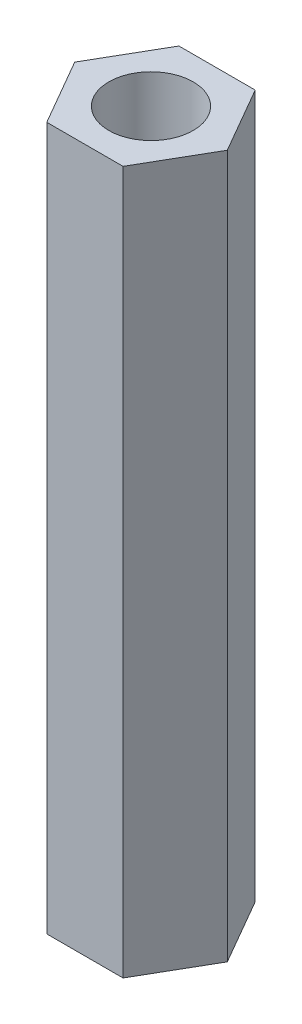
ISO-10303-21;
HEADER;
FILE_DESCRIPTION(('STEP AP214'),'2;1');
FILE_NAME('part.step','',(''),(''),'','','');
FILE_SCHEMA(('AUTOMOTIVE_DESIGN { 1 0 10303 214 1 1 1 1 }'));
ENDSEC;
DATA;
#1=APPLICATION_CONTEXT('core data for automotive mechanical design processes');
#2=APPLICATION_PROTOCOL_DEFINITION('international standard','automotive_design',2000,#1);
#3=PRODUCT_CONTEXT('',#1,'mechanical');
#4=PRODUCT('Part','Part','',(#3));
#5=PRODUCT_RELATED_PRODUCT_CATEGORY('part','',(#4));
#6=PRODUCT_DEFINITION_FORMATION('','',#4);
#7=PRODUCT_DEFINITION_CONTEXT('part definition',#1,'design');
#8=PRODUCT_DEFINITION('design','',#6,#7);
#9=PRODUCT_DEFINITION_SHAPE('','',#8);
#10=(LENGTH_UNIT() NAMED_UNIT(*) SI_UNIT(.MILLI.,.METRE.));
#11=(NAMED_UNIT(*) PLANE_ANGLE_UNIT() SI_UNIT($,.RADIAN.));
#12=(NAMED_UNIT(*) SI_UNIT($,.STERADIAN.) SOLID_ANGLE_UNIT());
#13=UNCERTAINTY_MEASURE_WITH_UNIT(LENGTH_MEASURE(1.E-05),#10,'distance_accuracy_value','');
#14=(GEOMETRIC_REPRESENTATION_CONTEXT(3) GLOBAL_UNCERTAINTY_ASSIGNED_CONTEXT((#13)) GLOBAL_UNIT_ASSIGNED_CONTEXT((#10,
#11,#12)) REPRESENTATION_CONTEXT('',''));
#15=CARTESIAN_POINT('',(0.,0.,0.));
#16=DIRECTION('',(0.,0.,1.));
#17=DIRECTION('',(1.,0.,0.));
#18=AXIS2_PLACEMENT_3D('',#15,#16,#17);
#19=CARTESIAN_POINT('',(0.,25.,0.));
#20=DIRECTION('',(0.,1.,0.));
#21=DIRECTION('',(0.,0.,1.));
#22=AXIS2_PLACEMENT_3D('',#19,#20,#21);
#23=PLANE('',#22);
#24=DIRECTION('',(0.5,0.,-0.866025403784439));
#25=VECTOR('',#24,1.);
#26=CARTESIAN_POINT('',(1.35677313259562,25.,2.35));
#27=LINE('',#26,#25);
#28=CARTESIAN_POINT('',(1.35677313259562,25.,2.35));
#29=VERTEX_POINT('',#28);
#30=CARTESIAN_POINT('',(2.71354626519124,25.,0.));
#31=VERTEX_POINT('',#30);
#32=EDGE_CURVE('E130',#29,#31,#27,.T.);
#33=ORIENTED_EDGE('',*,*,#32,.T.);
#34=DIRECTION('',(-0.5,0.,-0.866025403784439));
#35=VECTOR('',#34,1.);
#36=CARTESIAN_POINT('',(2.71354626519124,25.,0.));
#37=LINE('',#36,#35);
#38=CARTESIAN_POINT('',(1.35677313259562,25.,-2.35));
#39=VERTEX_POINT('',#38);
#40=EDGE_CURVE('E88',#31,#39,#37,.T.);
#41=ORIENTED_EDGE('',*,*,#40,.T.);
#42=DIRECTION('',(-1.,0.,0.));
#43=VECTOR('',#42,1.);
#44=CARTESIAN_POINT('',(1.35677313259562,25.,-2.35));
#45=LINE('',#44,#43);
#46=CARTESIAN_POINT('',(-1.35677313259562,25.,-2.35));
#47=VERTEX_POINT('',#46);
#48=EDGE_CURVE('E101',#39,#47,#45,.T.);
#49=ORIENTED_EDGE('',*,*,#48,.T.);
#50=DIRECTION('',(-0.5,0.,0.866025403784439));
#51=VECTOR('',#50,1.);
#52=CARTESIAN_POINT('',(-1.35677313259562,25.,-2.35));
#53=LINE('',#52,#51);
#54=CARTESIAN_POINT('',(-2.71354626519124,25.,0.));
#55=VERTEX_POINT('',#54);
#56=EDGE_CURVE('E95',#47,#55,#53,.T.);
#57=ORIENTED_EDGE('',*,*,#56,.T.);
#58=DIRECTION('',(0.5,0.,0.866025403784439));
#59=VECTOR('',#58,1.);
#60=CARTESIAN_POINT('',(-2.71354626519124,25.,0.));
#61=LINE('',#60,#59);
#62=CARTESIAN_POINT('',(-1.35677313259562,25.,2.35));
#63=VERTEX_POINT('',#62);
#64=EDGE_CURVE('E99',#55,#63,#61,.T.);
#65=ORIENTED_EDGE('',*,*,#64,.T.);
#66=DIRECTION('',(1.,0.,0.));
#67=VECTOR('',#66,1.);
#68=CARTESIAN_POINT('',(-1.35677313259562,25.,2.35));
#69=LINE('',#68,#67);
#70=EDGE_CURVE('E51',#63,#29,#69,.T.);
#71=ORIENTED_EDGE('',*,*,#70,.T.);
#72=EDGE_LOOP('',(#33,#41,#49,#57,#65,#71));
#73=FACE_BOUND('',#72,.T.);
#74=CARTESIAN_POINT('',(0.,25.,0.));
#75=DIRECTION('',(0.,1.,0.));
#76=DIRECTION('',(0.,0.,1.));
#77=AXIS2_PLACEMENT_3D('',#74,#75,#76);
#78=CIRCLE('',#77,1.5);
#79=CARTESIAN_POINT('',(0.,25.,1.5));
#80=VERTEX_POINT('',#79);
#81=EDGE_CURVE('E123',#80,#80,#78,.T.);
#82=ORIENTED_EDGE('',*,*,#81,.F.);
#83=EDGE_LOOP('',(#82));
#84=FACE_BOUND('',#83,.T.);
#85=ADVANCED_FACE('F34',(#73,#84),#23,.T.);
#86=CARTESIAN_POINT('',(0.,0.,0.));
#87=DIRECTION('',(0.,1.,0.));
#88=DIRECTION('',(0.,0.,1.));
#89=AXIS2_PLACEMENT_3D('',#86,#87,#88);
#90=PLANE('',#89);
#91=DIRECTION('',(0.5,0.,-0.866025403784439));
#92=VECTOR('',#91,1.);
#93=CARTESIAN_POINT('',(1.35677313259562,0.,2.35));
#94=LINE('',#93,#92);
#95=CARTESIAN_POINT('',(1.35677313259562,0.,2.35));
#96=VERTEX_POINT('',#95);
#97=CARTESIAN_POINT('',(2.71354626519124,0.,0.));
#98=VERTEX_POINT('',#97);
#99=EDGE_CURVE('E119',#96,#98,#94,.T.);
#100=ORIENTED_EDGE('',*,*,#99,.F.);
#101=DIRECTION('',(1.,0.,0.));
#102=VECTOR('',#101,1.);
#103=CARTESIAN_POINT('',(-1.35677313259562,0.,2.35));
#104=LINE('',#103,#102);
#105=CARTESIAN_POINT('',(-1.35677313259562,0.,2.35));
#106=VERTEX_POINT('',#105);
#107=EDGE_CURVE('E80',#106,#96,#104,.T.);
#108=ORIENTED_EDGE('',*,*,#107,.F.);
#109=DIRECTION('',(0.5,0.,0.866025403784439));
#110=VECTOR('',#109,1.);
#111=CARTESIAN_POINT('',(-2.71354626519124,0.,0.));
#112=LINE('',#111,#110);
#113=CARTESIAN_POINT('',(-2.71354626519124,0.,0.));
#114=VERTEX_POINT('',#113);
#115=EDGE_CURVE('E74',#114,#106,#112,.T.);
#116=ORIENTED_EDGE('',*,*,#115,.F.);
#117=DIRECTION('',(-0.5,0.,0.866025403784439));
#118=VECTOR('',#117,1.);
#119=CARTESIAN_POINT('',(-1.35677313259562,0.,-2.35));
#120=LINE('',#119,#118);
#121=CARTESIAN_POINT('',(-1.35677313259562,0.,-2.35));
#122=VERTEX_POINT('',#121);
#123=EDGE_CURVE('E109',#122,#114,#120,.T.);
#124=ORIENTED_EDGE('',*,*,#123,.F.);
#125=DIRECTION('',(-1.,0.,0.));
#126=VECTOR('',#125,1.);
#127=CARTESIAN_POINT('',(1.35677313259562,0.,-2.35));
#128=LINE('',#127,#126);
#129=CARTESIAN_POINT('',(1.35677313259562,0.,-2.35));
#130=VERTEX_POINT('',#129);
#131=EDGE_CURVE('E125',#130,#122,#128,.T.);
#132=ORIENTED_EDGE('',*,*,#131,.F.);
#133=DIRECTION('',(-0.5,0.,-0.866025403784439));
#134=VECTOR('',#133,1.);
#135=CARTESIAN_POINT('',(2.71354626519124,0.,0.));
#136=LINE('',#135,#134);
#137=EDGE_CURVE('E122',#98,#130,#136,.T.);
#138=ORIENTED_EDGE('',*,*,#137,.F.);
#139=EDGE_LOOP('',(#100,#108,#116,#124,#132,#138));
#140=FACE_BOUND('',#139,.T.);
#141=CARTESIAN_POINT('',(0.,0.,0.));
#142=DIRECTION('',(0.,1.,0.));
#143=DIRECTION('',(0.,0.,1.));
#144=AXIS2_PLACEMENT_3D('',#141,#142,#143);
#145=CIRCLE('',#144,1.5);
#146=CARTESIAN_POINT('',(0.,0.,1.5));
#147=VERTEX_POINT('',#146);
#148=EDGE_CURVE('E223',#147,#147,#145,.T.);
#149=ORIENTED_EDGE('',*,*,#148,.T.);
#150=EDGE_LOOP('',(#149));
#151=FACE_BOUND('',#150,.T.);
#152=ADVANCED_FACE('F139',(#140,#151),#90,.F.);
#153=CARTESIAN_POINT('',(1.35677313259562,25.,2.35));
#154=DIRECTION('',(-0.866025403784439,0.,-0.5));
#155=DIRECTION('',(-0.5,0.,0.866025403784439));
#156=AXIS2_PLACEMENT_3D('',#153,#154,#155);
#157=PLANE('',#156);
#158=ORIENTED_EDGE('',*,*,#99,.T.);
#159=DIRECTION('',(0.,-1.,0.));
#160=VECTOR('',#159,1.);
#161=CARTESIAN_POINT('',(2.71354626519124,25.,0.));
#162=LINE('',#161,#160);
#163=EDGE_CURVE('E11',#31,#98,#162,.T.);
#164=ORIENTED_EDGE('',*,*,#163,.F.);
#165=ORIENTED_EDGE('',*,*,#32,.F.);
#166=DIRECTION('',(0.,-1.,0.));
#167=VECTOR('',#166,1.);
#168=CARTESIAN_POINT('',(1.35677313259562,25.,2.35));
#169=LINE('',#168,#167);
#170=EDGE_CURVE('E115',#29,#96,#169,.T.);
#171=ORIENTED_EDGE('',*,*,#170,.T.);
#172=EDGE_LOOP('',(#158,#164,#165,#171));
#173=FACE_BOUND('',#172,.T.);
#174=ADVANCED_FACE('F36',(#173),#157,.F.);
#175=CARTESIAN_POINT('',(2.71354626519124,25.,0.));
#176=DIRECTION('',(-0.866025403784439,0.,0.5));
#177=DIRECTION('',(0.5,0.,0.866025403784439));
#178=AXIS2_PLACEMENT_3D('',#175,#176,#177);
#179=PLANE('',#178);
#180=ORIENTED_EDGE('',*,*,#137,.T.);
#181=DIRECTION('',(0.,-1.,0.));
#182=VECTOR('',#181,1.);
#183=CARTESIAN_POINT('',(1.35677313259562,25.,-2.35));
#184=LINE('',#183,#182);
#185=EDGE_CURVE('E43',#39,#130,#184,.T.);
#186=ORIENTED_EDGE('',*,*,#185,.F.);
#187=ORIENTED_EDGE('',*,*,#40,.F.);
#188=ORIENTED_EDGE('',*,*,#163,.T.);
#189=EDGE_LOOP('',(#180,#186,#187,#188));
#190=FACE_BOUND('',#189,.T.);
#191=ADVANCED_FACE('F164',(#190),#179,.F.);
#192=CARTESIAN_POINT('',(1.35677313259562,25.,-2.35));
#193=DIRECTION('',(0.,0.,1.));
#194=DIRECTION('',(1.,0.,0.));
#195=AXIS2_PLACEMENT_3D('',#192,#193,#194);
#196=PLANE('',#195);
#197=ORIENTED_EDGE('',*,*,#131,.T.);
#198=DIRECTION('',(0.,-1.,0.));
#199=VECTOR('',#198,1.);
#200=CARTESIAN_POINT('',(-1.35677313259562,25.,-2.35));
#201=LINE('',#200,#199);
#202=EDGE_CURVE('E110',#47,#122,#201,.T.);
#203=ORIENTED_EDGE('',*,*,#202,.F.);
#204=ORIENTED_EDGE('',*,*,#48,.F.);
#205=ORIENTED_EDGE('',*,*,#185,.T.);
#206=EDGE_LOOP('',(#197,#203,#204,#205));
#207=FACE_BOUND('',#206,.T.);
#208=ADVANCED_FACE('F136',(#207),#196,.F.);
#209=CARTESIAN_POINT('',(-1.35677313259562,25.,-2.35));
#210=DIRECTION('',(0.866025403784439,0.,0.5));
#211=DIRECTION('',(0.5,0.,-0.866025403784439));
#212=AXIS2_PLACEMENT_3D('',#209,#210,#211);
#213=PLANE('',#212);
#214=ORIENTED_EDGE('',*,*,#123,.T.);
#215=DIRECTION('',(0.,-1.,0.));
#216=VECTOR('',#215,1.);
#217=CARTESIAN_POINT('',(-2.71354626519124,25.,0.));
#218=LINE('',#217,#216);
#219=EDGE_CURVE('E106',#55,#114,#218,.T.);
#220=ORIENTED_EDGE('',*,*,#219,.F.);
#221=ORIENTED_EDGE('',*,*,#56,.F.);
#222=ORIENTED_EDGE('',*,*,#202,.T.);
#223=EDGE_LOOP('',(#214,#220,#221,#222));
#224=FACE_BOUND('',#223,.T.);
#225=ADVANCED_FACE('F107',(#224),#213,.F.);
#226=CARTESIAN_POINT('',(-2.71354626519124,25.,0.));
#227=DIRECTION('',(0.866025403784439,0.,-0.5));
#228=DIRECTION('',(-0.5,0.,-0.866025403784439));
#229=AXIS2_PLACEMENT_3D('',#226,#227,#228);
#230=PLANE('',#229);
#231=ORIENTED_EDGE('',*,*,#115,.T.);
#232=DIRECTION('',(0.,-1.,0.));
#233=VECTOR('',#232,1.);
#234=CARTESIAN_POINT('',(-1.35677313259562,25.,2.35));
#235=LINE('',#234,#233);
#236=EDGE_CURVE('E111',#63,#106,#235,.T.);
#237=ORIENTED_EDGE('',*,*,#236,.F.);
#238=ORIENTED_EDGE('',*,*,#64,.F.);
#239=ORIENTED_EDGE('',*,*,#219,.T.);
#240=EDGE_LOOP('',(#231,#237,#238,#239));
#241=FACE_BOUND('',#240,.T.);
#242=ADVANCED_FACE('F113',(#241),#230,.F.);
#243=CARTESIAN_POINT('',(-1.35677313259562,25.,2.35));
#244=DIRECTION('',(0.,0.,-1.));
#245=DIRECTION('',(-1.,0.,0.));
#246=AXIS2_PLACEMENT_3D('',#243,#244,#245);
#247=PLANE('',#246);
#248=ORIENTED_EDGE('',*,*,#107,.T.);
#249=ORIENTED_EDGE('',*,*,#170,.F.);
#250=ORIENTED_EDGE('',*,*,#70,.F.);
#251=ORIENTED_EDGE('',*,*,#236,.T.);
#252=EDGE_LOOP('',(#248,#249,#250,#251));
#253=FACE_BOUND('',#252,.T.);
#254=ADVANCED_FACE('F144',(#253),#247,.F.);
#255=CARTESIAN_POINT('',(0.,25.,0.));
#256=DIRECTION('',(0.,-1.,0.));
#257=DIRECTION('',(0.,0.,-1.));
#258=AXIS2_PLACEMENT_3D('',#255,#256,#257);
#259=CYLINDRICAL_SURFACE('',#258,1.5);
#260=ORIENTED_EDGE('',*,*,#81,.T.);
#261=EDGE_LOOP('',(#260));
#262=FACE_BOUND('',#261,.T.);
#263=ORIENTED_EDGE('',*,*,#148,.F.);
#264=EDGE_LOOP('',(#263));
#265=FACE_BOUND('',#264,.T.);
#266=ADVANCED_FACE('F146',(#262,#265),#259,.F.);
#267=CLOSED_SHELL('',(#85,#152,#174,#191,#208,#225,#242,#254,#266));
#268=MANIFOLD_SOLID_BREP('B2',#267);
#269=ADVANCED_BREP_SHAPE_REPRESENTATION('',(#18,#268),#14);
#270=SHAPE_DEFINITION_REPRESENTATION(#9,#269);
ENDSEC;
END-ISO-10303-21;
